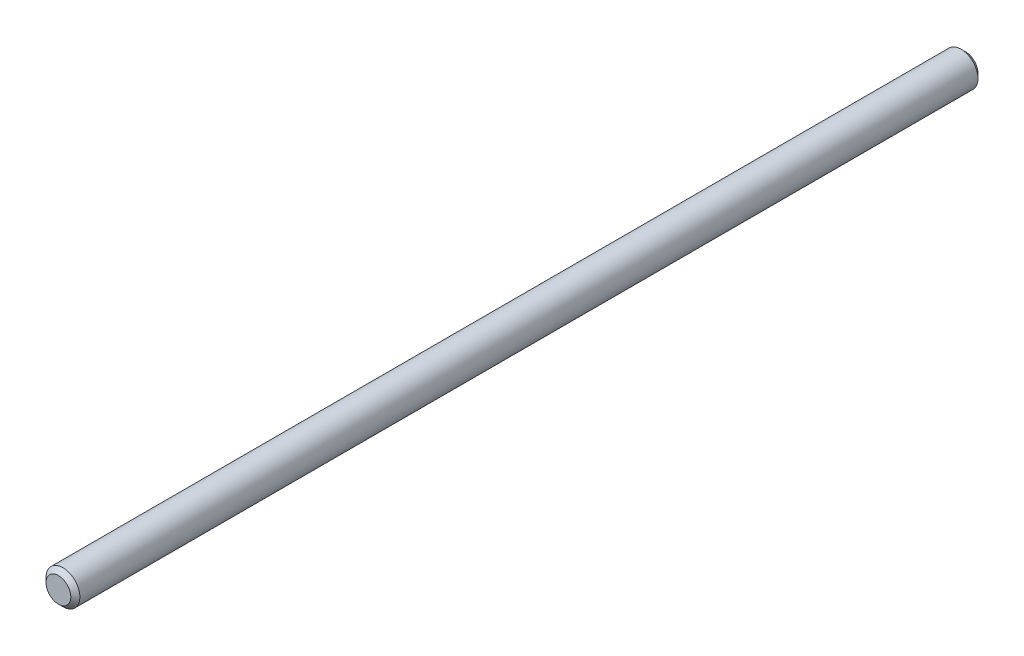
ISO-10303-21;
HEADER;
FILE_DESCRIPTION(('STEP AP214'),'2;1');
FILE_NAME('part.step','',(''),(''),'','','');
FILE_SCHEMA(('AUTOMOTIVE_DESIGN { 1 0 10303 214 1 1 1 1 }'));
ENDSEC;
DATA;
#1=APPLICATION_CONTEXT('core data for automotive mechanical design processes');
#2=APPLICATION_PROTOCOL_DEFINITION('international standard','automotive_design',2000,#1);
#3=PRODUCT_CONTEXT('',#1,'mechanical');
#4=PRODUCT('Part','Part','',(#3));
#5=PRODUCT_RELATED_PRODUCT_CATEGORY('part','',(#4));
#6=PRODUCT_DEFINITION_FORMATION('','',#4);
#7=PRODUCT_DEFINITION_CONTEXT('part definition',#1,'design');
#8=PRODUCT_DEFINITION('design','',#6,#7);
#9=PRODUCT_DEFINITION_SHAPE('','',#8);
#10=(LENGTH_UNIT() NAMED_UNIT(*) SI_UNIT(.MILLI.,.METRE.));
#11=(NAMED_UNIT(*) PLANE_ANGLE_UNIT() SI_UNIT($,.RADIAN.));
#12=(NAMED_UNIT(*) SI_UNIT($,.STERADIAN.) SOLID_ANGLE_UNIT());
#13=UNCERTAINTY_MEASURE_WITH_UNIT(LENGTH_MEASURE(1.E-05),#10,'distance_accuracy_value','');
#14=(GEOMETRIC_REPRESENTATION_CONTEXT(3) GLOBAL_UNCERTAINTY_ASSIGNED_CONTEXT((#13)) GLOBAL_UNIT_ASSIGNED_CONTEXT((#10,
#11,#12)) REPRESENTATION_CONTEXT('',''));
#15=CARTESIAN_POINT('',(0.,0.,0.));
#16=DIRECTION('',(0.,0.,1.));
#17=DIRECTION('',(1.,0.,0.));
#18=AXIS2_PLACEMENT_3D('',#15,#16,#17);
#19=CARTESIAN_POINT('',(0.,0.,-76.2));
#20=DIRECTION('',(0.,0.,1.));
#21=DIRECTION('',(1.,0.,0.));
#22=AXIS2_PLACEMENT_3D('',#19,#20,#21);
#23=CYLINDRICAL_SURFACE('',#22,1.4224);
#24=CARTESIAN_POINT('',(0.,0.,-75.819));
#25=DIRECTION('',(0.,0.,1.));
#26=DIRECTION('',(1.,0.,0.));
#27=AXIS2_PLACEMENT_3D('',#24,#25,#26);
#28=CIRCLE('',#27,1.4224);
#29=CARTESIAN_POINT('',(1.4224,0.,-75.819));
#30=VERTEX_POINT('',#29);
#31=EDGE_CURVE('E44',#30,#30,#28,.T.);
#32=CARTESIAN_POINT('',(0.,0.,-0.380999999999992));
#33=DIRECTION('',(0.,0.,1.));
#34=DIRECTION('',(1.,0.,0.));
#35=AXIS2_PLACEMENT_3D('',#32,#33,#34);
#36=CIRCLE('',#35,1.4224);
#37=CARTESIAN_POINT('',(1.4224,0.,-0.380999999999992));
#38=VERTEX_POINT('',#37);
#39=EDGE_CURVE('E48',#38,#38,#36,.F.);
#40=CARTESIAN_POINT('',(1.4224,0.,-75.819));
#41=CARTESIAN_POINT('',(1.4224,0.,-75.0331875));
#42=CARTESIAN_POINT('',(1.4224,0.,-74.247375));
#43=CARTESIAN_POINT('',(1.4224,0.,-72.67575));
#44=CARTESIAN_POINT('',(1.4224,0.,-71.8899375));
#45=CARTESIAN_POINT('',(1.4224,0.,-70.3183125));
#46=CARTESIAN_POINT('',(1.4224,0.,-69.5325));
#47=CARTESIAN_POINT('',(1.4224,0.,-67.960875));
#48=CARTESIAN_POINT('',(1.4224,0.,-67.1750625));
#49=CARTESIAN_POINT('',(1.4224,0.,-65.6034375));
#50=CARTESIAN_POINT('',(1.4224,0.,-64.817625));
#51=CARTESIAN_POINT('',(1.4224,0.,-63.246));
#52=CARTESIAN_POINT('',(1.4224,0.,-62.4601875));
#53=CARTESIAN_POINT('',(1.4224,0.,-60.8885625));
#54=CARTESIAN_POINT('',(1.4224,0.,-60.10275));
#55=CARTESIAN_POINT('',(1.4224,0.,-58.531125));
#56=CARTESIAN_POINT('',(1.4224,0.,-57.7453125));
#57=CARTESIAN_POINT('',(1.4224,0.,-56.1736875));
#58=CARTESIAN_POINT('',(1.4224,0.,-55.387875));
#59=CARTESIAN_POINT('',(1.4224,0.,-53.81625));
#60=CARTESIAN_POINT('',(1.4224,0.,-53.0304375));
#61=CARTESIAN_POINT('',(1.4224,0.,-51.4588125));
#62=CARTESIAN_POINT('',(1.4224,0.,-50.673));
#63=CARTESIAN_POINT('',(1.4224,0.,-49.101375));
#64=CARTESIAN_POINT('',(1.4224,0.,-48.3155625));
#65=CARTESIAN_POINT('',(1.4224,0.,-46.7439375));
#66=CARTESIAN_POINT('',(1.4224,0.,-45.958125));
#67=CARTESIAN_POINT('',(1.4224,0.,-44.3865));
#68=CARTESIAN_POINT('',(1.4224,0.,-43.6006875));
#69=CARTESIAN_POINT('',(1.4224,0.,-42.0290625));
#70=CARTESIAN_POINT('',(1.4224,0.,-41.24325));
#71=CARTESIAN_POINT('',(1.4224,0.,-39.671625));
#72=CARTESIAN_POINT('',(1.4224,0.,-38.8858125));
#73=CARTESIAN_POINT('',(1.4224,0.,-37.3141875));
#74=CARTESIAN_POINT('',(1.4224,0.,-36.528375));
#75=CARTESIAN_POINT('',(1.4224,0.,-34.95675));
#76=CARTESIAN_POINT('',(1.4224,0.,-34.1709375));
#77=CARTESIAN_POINT('',(1.4224,0.,-32.5993125));
#78=CARTESIAN_POINT('',(1.4224,0.,-31.8135));
#79=CARTESIAN_POINT('',(1.4224,0.,-30.241875));
#80=CARTESIAN_POINT('',(1.4224,0.,-29.4560625));
#81=CARTESIAN_POINT('',(1.4224,0.,-27.8844375));
#82=CARTESIAN_POINT('',(1.4224,0.,-27.098625));
#83=CARTESIAN_POINT('',(1.4224,0.,-25.527));
#84=CARTESIAN_POINT('',(1.4224,0.,-24.7411875));
#85=CARTESIAN_POINT('',(1.4224,0.,-23.1695625));
#86=CARTESIAN_POINT('',(1.4224,0.,-22.38375));
#87=CARTESIAN_POINT('',(1.4224,0.,-20.812125));
#88=CARTESIAN_POINT('',(1.4224,0.,-20.0263125));
#89=CARTESIAN_POINT('',(1.4224,0.,-18.4546875));
#90=CARTESIAN_POINT('',(1.4224,0.,-17.668875));
#91=CARTESIAN_POINT('',(1.4224,0.,-16.09725));
#92=CARTESIAN_POINT('',(1.4224,0.,-15.3114375));
#93=CARTESIAN_POINT('',(1.4224,0.,-13.7398125));
#94=CARTESIAN_POINT('',(1.4224,0.,-12.954));
#95=CARTESIAN_POINT('',(1.4224,0.,-11.382375));
#96=CARTESIAN_POINT('',(1.4224,0.,-10.5965625));
#97=CARTESIAN_POINT('',(1.4224,0.,-9.02493749999998));
#98=CARTESIAN_POINT('',(1.4224,0.,-8.23912499999998));
#99=CARTESIAN_POINT('',(1.4224,0.,-6.66749999999998));
#100=CARTESIAN_POINT('',(1.4224,0.,-5.88168749999999));
#101=CARTESIAN_POINT('',(1.4224,0.,-4.3100625));
#102=CARTESIAN_POINT('',(1.4224,0.,-3.52425));
#103=CARTESIAN_POINT('',(1.4224,0.,-1.952625));
#104=CARTESIAN_POINT('',(1.4224,0.,-1.16681249999999));
#105=CARTESIAN_POINT('',(1.4224,0.,-0.380999999999992));
#106=B_SPLINE_CURVE_WITH_KNOTS('',3,(#40,#41,#42,#43,#44,#45,#46,#47,#48,#49,#50,#51,#52,#53,
#54,#55,#56,#57,#58,#59,#60,#61,#62,#63,#64,#65,#66,#67,#68,#69,#70,#71,#72,#73,#74,#75,#76,#77,
#78,#79,#80,#81,#82,#83,#84,#85,#86,#87,#88,#89,#90,#91,#92,#93,#94,#95,#96,#97,#98,#99,#100,
#101,#102,#103,#104,#105),.UNSPECIFIED.,.F.,.F.,(4,2,2,2,2,2,2,2,2,2,2,2,2,2,2,2,2,2,2,2,2,2,2,
2,2,2,2,2,2,2,2,2,4),(0.,2.3574375,4.71487500000001,7.07231250000001,9.42975,11.7871875,
14.144625,16.5020625,18.8595,21.2169375,23.574375,25.9318125,28.28925,30.6466875,33.004125,
35.3615625,37.719,40.0764375,42.433875,44.7913125,47.14875,49.5061875,51.863625,54.2210625,
56.5785,58.9359375,61.293375,63.6508125,66.00825,68.3656875,70.723125,73.0805625,75.438),.UNSPECIFIED.);
#107=EDGE_CURVE('BSEAM33',#30,#38,#106,.T.);
#108=ORIENTED_EDGE('',*,*,#31,.T.);
#109=ORIENTED_EDGE('',*,*,#39,.T.);
#110=ORIENTED_EDGE('',*,*,#107,.T.);
#111=ORIENTED_EDGE('',*,*,#107,.F.);
#112=EDGE_LOOP('',(#108,#110,#109,#111));
#113=FACE_BOUND('',#112,.T.);
#114=ADVANCED_FACE('F33',(#113),#23,.T.);
#115=CARTESIAN_POINT('',(0.,0.,-76.2));
#116=DIRECTION('',(0.,0.,1.));
#117=DIRECTION('',(1.,0.,0.));
#118=AXIS2_PLACEMENT_3D('',#115,#116,#117);
#119=PLANE('',#118);
#120=CARTESIAN_POINT('',(0.,0.,-76.2));
#121=DIRECTION('',(0.,0.,1.));
#122=DIRECTION('',(1.,0.,0.));
#123=AXIS2_PLACEMENT_3D('',#120,#121,#122);
#124=CIRCLE('',#123,1.04139999999997);
#125=CARTESIAN_POINT('',(1.04139999999997,0.,-76.2));
#126=VERTEX_POINT('',#125);
#127=EDGE_CURVE('E40',#126,#126,#124,.F.);
#128=ORIENTED_EDGE('',*,*,#127,.T.);
#129=EDGE_LOOP('',(#128));
#130=FACE_BOUND('',#129,.T.);
#131=ADVANCED_FACE('F64',(#130),#119,.F.);
#132=CARTESIAN_POINT('',(0.,0.,0.));
#133=DIRECTION('',(0.,0.,1.));
#134=DIRECTION('',(1.,0.,0.));
#135=AXIS2_PLACEMENT_3D('',#132,#133,#134);
#136=PLANE('',#135);
#137=CARTESIAN_POINT('',(0.,0.,0.));
#138=DIRECTION('',(0.,0.,1.));
#139=DIRECTION('',(1.,0.,0.));
#140=AXIS2_PLACEMENT_3D('',#137,#138,#139);
#141=CIRCLE('',#140,1.04139999999999);
#142=CARTESIAN_POINT('',(1.04139999999999,0.,0.));
#143=VERTEX_POINT('',#142);
#144=EDGE_CURVE('E10',#143,#143,#141,.T.);
#145=ORIENTED_EDGE('',*,*,#144,.T.);
#146=EDGE_LOOP('',(#145));
#147=FACE_BOUND('',#146,.T.);
#148=ADVANCED_FACE('F61',(#147),#136,.T.);
#149=CARTESIAN_POINT('',(0.,0.,-75.819));
#150=DIRECTION('',(0.,0.,1.));
#151=DIRECTION('',(1.,0.,0.));
#152=AXIS2_PLACEMENT_3D('',#149,#150,#151);
#153=CONICAL_SURFACE('',#152,1.4224,0.785398163397443);
#154=ORIENTED_EDGE('',*,*,#127,.F.);
#155=EDGE_LOOP('',(#154));
#156=FACE_BOUND('',#155,.T.);
#157=ORIENTED_EDGE('',*,*,#31,.F.);
#158=EDGE_LOOP('',(#157));
#159=FACE_BOUND('',#158,.T.);
#160=ADVANCED_FACE('F57',(#156,#159),#153,.T.);
#161=CARTESIAN_POINT('',(0.,0.,0.));
#162=DIRECTION('',(0.,0.,-1.));
#163=DIRECTION('',(-1.,0.,0.));
#164=AXIS2_PLACEMENT_3D('',#161,#162,#163);
#165=CONICAL_SURFACE('',#164,1.04139999999999,0.785398163397471);
#166=ORIENTED_EDGE('',*,*,#39,.F.);
#167=EDGE_LOOP('',(#166));
#168=FACE_BOUND('',#167,.T.);
#169=ORIENTED_EDGE('',*,*,#144,.F.);
#170=EDGE_LOOP('',(#169));
#171=FACE_BOUND('',#170,.T.);
#172=ADVANCED_FACE('F35',(#168,#171),#165,.T.);
#173=CLOSED_SHELL('',(#114,#131,#148,#160,#172));
#174=MANIFOLD_SOLID_BREP('B2',#173);
#175=ADVANCED_BREP_SHAPE_REPRESENTATION('',(#18,#174),#14);
#176=SHAPE_DEFINITION_REPRESENTATION(#9,#175);
ENDSEC;
END-ISO-10303-21;
